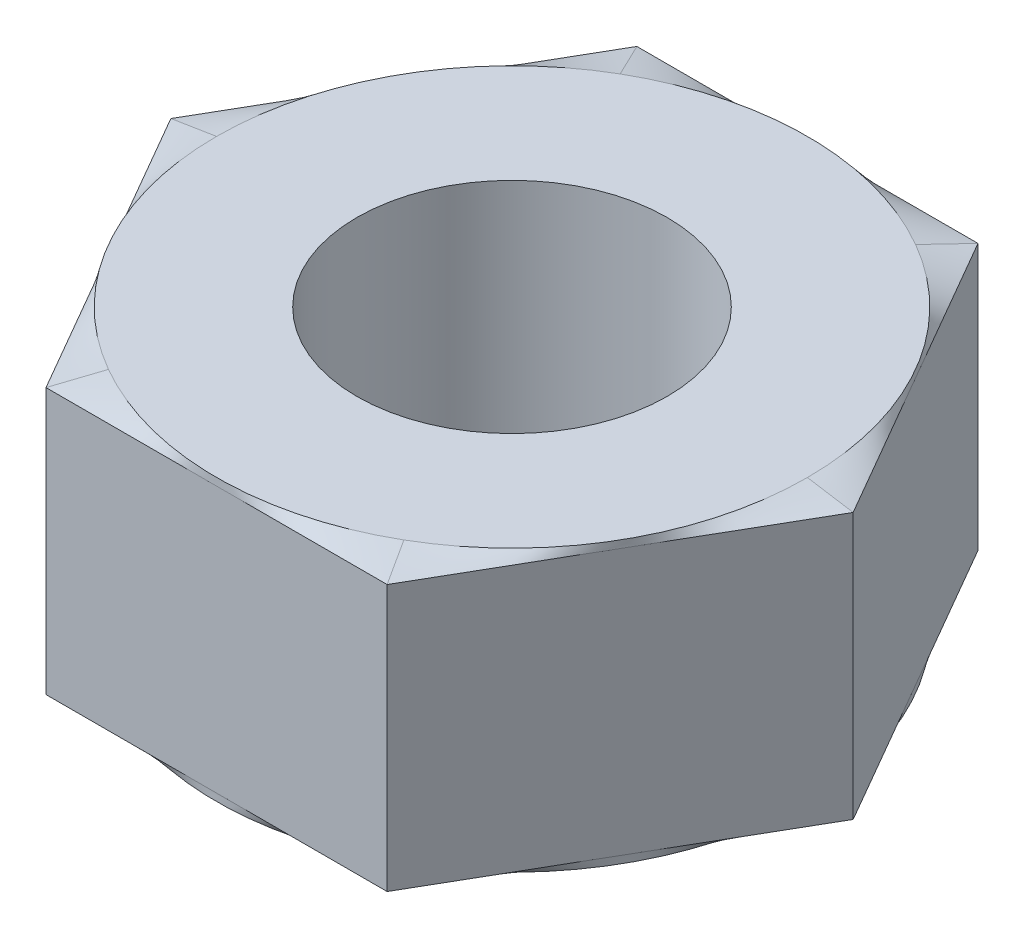
ISO-10303-21;
HEADER;
FILE_DESCRIPTION(('STEP AP214'),'2;1');
FILE_NAME('part.step','',(''),(''),'','','');
FILE_SCHEMA(('AUTOMOTIVE_DESIGN { 1 0 10303 214 1 1 1 1 }'));
ENDSEC;
DATA;
#1=APPLICATION_CONTEXT('core data for automotive mechanical design processes');
#2=APPLICATION_PROTOCOL_DEFINITION('international standard','automotive_design',2000,#1);
#3=PRODUCT_CONTEXT('',#1,'mechanical');
#4=PRODUCT('Part','Part','',(#3));
#5=PRODUCT_RELATED_PRODUCT_CATEGORY('part','',(#4));
#6=PRODUCT_DEFINITION_FORMATION('','',#4);
#7=PRODUCT_DEFINITION_CONTEXT('part definition',#1,'design');
#8=PRODUCT_DEFINITION('design','',#6,#7);
#9=PRODUCT_DEFINITION_SHAPE('','',#8);
#10=(LENGTH_UNIT() NAMED_UNIT(*) SI_UNIT(.MILLI.,.METRE.));
#11=(NAMED_UNIT(*) PLANE_ANGLE_UNIT() SI_UNIT($,.RADIAN.));
#12=(NAMED_UNIT(*) SI_UNIT($,.STERADIAN.) SOLID_ANGLE_UNIT());
#13=UNCERTAINTY_MEASURE_WITH_UNIT(LENGTH_MEASURE(1.E-05),#10,'distance_accuracy_value','');
#14=(GEOMETRIC_REPRESENTATION_CONTEXT(3) GLOBAL_UNCERTAINTY_ASSIGNED_CONTEXT((#13)) GLOBAL_UNIT_ASSIGNED_CONTEXT((#10,
#11,#12)) REPRESENTATION_CONTEXT('',''));
#15=CARTESIAN_POINT('',(0.,0.,0.));
#16=DIRECTION('',(0.,0.,1.));
#17=DIRECTION('',(1.,0.,0.));
#18=AXIS2_PLACEMENT_3D('',#15,#16,#17);
#19=CARTESIAN_POINT('',(2.3094010767585,1.8,-4.));
#20=DIRECTION('',(-0.866025403784439,0.,0.5));
#21=DIRECTION('',(-0.5,0.,-0.866025403784439));
#22=AXIS2_PLACEMENT_3D('',#19,#20,#21);
#23=PLANE('',#22);
#24=DIRECTION('',(-0.5,0.,-0.866025403784439));
#25=VECTOR('',#24,1.);
#26=CARTESIAN_POINT('',(2.3094010767585,0.,-4.));
#27=LINE('',#26,#25);
#28=CARTESIAN_POINT('',(2.3094010767585,0.,-4.));
#29=VERTEX_POINT('',#28);
#30=CARTESIAN_POINT('',(4.618802153517,0.,0.));
#31=VERTEX_POINT('',#30);
#32=EDGE_CURVE('E830',#29,#31,#27,.F.);
#33=ORIENTED_EDGE('',*,*,#32,.F.);
#34=DIRECTION('',(0.,-1.,0.));
#35=VECTOR('',#34,1.);
#36=CARTESIAN_POINT('',(2.3094010767585,1.8,-4.));
#37=LINE('',#36,#35);
#38=CARTESIAN_POINT('',(2.3094010767585,3.6,-4.));
#39=VERTEX_POINT('',#38);
#40=EDGE_CURVE('E547',#39,#29,#37,.T.);
#41=ORIENTED_EDGE('',*,*,#40,.F.);
#42=CARTESIAN_POINT('',(4.618802153517,3.6,0.));
#43=CARTESIAN_POINT('',(4.42635206378713,3.6,-0.33333333333333));
#44=CARTESIAN_POINT('',(4.23390197405726,3.6,-0.666666666666661));
#45=CARTESIAN_POINT('',(3.84900179459751,3.6,-1.33333333333333));
#46=CARTESIAN_POINT('',(3.65655170486763,3.6,-1.66666666666666));
#47=CARTESIAN_POINT('',(3.27165152540788,3.6,-2.33333333333333));
#48=CARTESIAN_POINT('',(3.07920143567801,3.6,-2.66666666666666));
#49=CARTESIAN_POINT('',(2.69430125621826,3.6,-3.33333333333333));
#50=CARTESIAN_POINT('',(2.50185116648838,3.6,-3.66666666666666));
#51=CARTESIAN_POINT('',(2.3094010767585,3.6,-4.));
#52=B_SPLINE_CURVE_WITH_KNOTS('',3,(#42,#43,#44,#45,#46,#47,#48,#49,#50,#51),.UNSPECIFIED.,.F.,
.F.,(4,2,2,2,4),(0.,0.25,0.5,0.75,1.),.UNSPECIFIED.);
#53=CARTESIAN_POINT('',(4.618802153517,3.6,0.));
#54=VERTEX_POINT('',#53);
#55=EDGE_CURVE('E308',#39,#54,#52,.F.);
#56=ORIENTED_EDGE('',*,*,#55,.T.);
#57=DIRECTION('',(0.,-1.,0.));
#58=VECTOR('',#57,1.);
#59=CARTESIAN_POINT('',(4.618802153517,1.8,0.));
#60=LINE('',#59,#58);
#61=EDGE_CURVE('E12',#54,#31,#60,.T.);
#62=ORIENTED_EDGE('',*,*,#61,.T.);
#63=EDGE_LOOP('',(#33,#41,#56,#62));
#64=FACE_BOUND('',#63,.T.);
#65=ADVANCED_FACE('F121',(#64),#23,.F.);
#66=CARTESIAN_POINT('',(4.618802153517,1.8,0.));
#67=DIRECTION('',(-0.866025403784438,0.,-0.5));
#68=DIRECTION('',(0.5,0.,-0.866025403784439));
#69=AXIS2_PLACEMENT_3D('',#66,#67,#68);
#70=PLANE('',#69);
#71=DIRECTION('',(0.5,0.,-0.866025403784439));
#72=VECTOR('',#71,1.);
#73=CARTESIAN_POINT('',(4.618802153517,0.,0.));
#74=LINE('',#73,#72);
#75=CARTESIAN_POINT('',(2.3094010767585,0.,4.));
#76=VERTEX_POINT('',#75);
#77=EDGE_CURVE('E860',#31,#76,#74,.F.);
#78=ORIENTED_EDGE('',*,*,#77,.F.);
#79=ORIENTED_EDGE('',*,*,#61,.F.);
#80=CARTESIAN_POINT('',(2.3094010767585,3.6,4.));
#81=CARTESIAN_POINT('',(2.40562612162344,3.6,3.83333333333333));
#82=CARTESIAN_POINT('',(2.50185116648838,3.6,3.66666666666667));
#83=CARTESIAN_POINT('',(2.69430125621825,3.6,3.33333333333333));
#84=CARTESIAN_POINT('',(2.79052630108319,3.6,3.16666666666666));
#85=CARTESIAN_POINT('',(2.98297639081307,3.6,2.83333333333333));
#86=CARTESIAN_POINT('',(3.079201435678,3.6,2.66666666666666));
#87=CARTESIAN_POINT('',(3.27165152540788,3.6,2.33333333333333));
#88=CARTESIAN_POINT('',(3.36787657027282,3.6,2.16666666666666));
#89=CARTESIAN_POINT('',(3.56032666000269,3.6,1.83333333333333));
#90=CARTESIAN_POINT('',(3.65655170486763,3.6,1.66666666666666));
#91=CARTESIAN_POINT('',(3.84900179459751,3.6,1.33333333333333));
#92=CARTESIAN_POINT('',(3.94522683946244,3.6,1.16666666666666));
#93=CARTESIAN_POINT('',(4.13767692919232,3.6,0.833333333333331));
#94=CARTESIAN_POINT('',(4.23390197405726,3.6,0.666666666666665));
#95=CARTESIAN_POINT('',(4.42635206378713,3.6,0.333333333333333));
#96=CARTESIAN_POINT('',(4.52257710865207,3.6,0.166666666666667));
#97=CARTESIAN_POINT('',(4.61880215351701,3.6,0.));
#98=B_SPLINE_CURVE_WITH_KNOTS('',3,(#80,#81,#82,#83,#84,#85,#86,#87,#88,#89,#90,#91,#92,#93,#94,
#95,#96,#97),.UNSPECIFIED.,.F.,.F.,(4,2,2,2,2,2,2,2,4),(0.,0.577350269189629,1.15470053837926,
1.73205080756888,2.30940107675851,2.88675134594813,3.46410161513776,4.04145188432738,
4.61880215351701),.UNSPECIFIED.);
#99=CARTESIAN_POINT('',(2.3094010767585,3.6,4.));
#100=VERTEX_POINT('',#99);
#101=EDGE_CURVE('E233',#54,#100,#98,.F.);
#102=ORIENTED_EDGE('',*,*,#101,.T.);
#103=DIRECTION('',(0.,-1.,0.));
#104=VECTOR('',#103,1.);
#105=CARTESIAN_POINT('',(2.3094010767585,1.8,4.));
#106=LINE('',#105,#104);
#107=EDGE_CURVE('E131',#100,#76,#106,.T.);
#108=ORIENTED_EDGE('',*,*,#107,.T.);
#109=EDGE_LOOP('',(#78,#79,#102,#108));
#110=FACE_BOUND('',#109,.T.);
#111=ADVANCED_FACE('F519',(#110),#70,.F.);
#112=CARTESIAN_POINT('',(2.3094010767585,1.8,4.));
#113=DIRECTION('',(0.,0.,-1.));
#114=DIRECTION('',(1.,0.,0.));
#115=AXIS2_PLACEMENT_3D('',#112,#113,#114);
#116=PLANE('',#115);
#117=DIRECTION('',(1.,0.,0.));
#118=VECTOR('',#117,1.);
#119=CARTESIAN_POINT('',(2.3094010767585,0.,4.));
#120=LINE('',#119,#118);
#121=CARTESIAN_POINT('',(-2.3094010767585,0.,4.));
#122=VERTEX_POINT('',#121);
#123=EDGE_CURVE('E858',#76,#122,#120,.F.);
#124=ORIENTED_EDGE('',*,*,#123,.F.);
#125=ORIENTED_EDGE('',*,*,#107,.F.);
#126=CARTESIAN_POINT('',(-2.30940107675851,3.6,4.));
#127=CARTESIAN_POINT('',(-2.11695098702863,3.6,4.));
#128=CARTESIAN_POINT('',(-1.92450089729876,3.6,4.));
#129=CARTESIAN_POINT('',(-1.53960071783901,3.6,4.));
#130=CARTESIAN_POINT('',(-1.34715062810913,3.6,4.));
#131=CARTESIAN_POINT('',(-0.96225044864938,3.6,4.));
#132=CARTESIAN_POINT('',(-0.769800358919504,3.6,4.));
#133=CARTESIAN_POINT('',(-0.384900179459754,3.6,4.));
#134=CARTESIAN_POINT('',(-0.192450089729879,3.6,4.));
#135=CARTESIAN_POINT('',(0.192450089729872,3.6,4.));
#136=CARTESIAN_POINT('',(0.384900179459747,3.6,4.));
#137=CARTESIAN_POINT('',(0.769800358919498,3.6,4.));
#138=CARTESIAN_POINT('',(0.962250448649373,3.6,4.));
#139=CARTESIAN_POINT('',(1.34715062810912,3.6,4.));
#140=CARTESIAN_POINT('',(1.539600717839,3.6,4.));
#141=CARTESIAN_POINT('',(1.92450089729875,3.6,4.));
#142=CARTESIAN_POINT('',(2.11695098702863,3.6,4.));
#143=CARTESIAN_POINT('',(2.3094010767585,3.6,4.));
#144=B_SPLINE_CURVE_WITH_KNOTS('',3,(#126,#127,#128,#129,#130,#131,#132,#133,#134,#135,#136,
#137,#138,#139,#140,#141,#142,#143),.UNSPECIFIED.,.F.,.F.,(4,2,2,2,2,2,2,2,4),(0.,
0.577350269189625,1.15470053837925,1.73205080756888,2.3094010767585,2.88675134594813,
3.46410161513775,4.04145188432738,4.61880215351701),.UNSPECIFIED.);
#145=CARTESIAN_POINT('',(-2.3094010767585,3.6,4.));
#146=VERTEX_POINT('',#145);
#147=EDGE_CURVE('E468',#100,#146,#144,.F.);
#148=ORIENTED_EDGE('',*,*,#147,.T.);
#149=DIRECTION('',(0.,-1.,0.));
#150=VECTOR('',#149,1.);
#151=CARTESIAN_POINT('',(-2.3094010767585,1.8,4.));
#152=LINE('',#151,#150);
#153=EDGE_CURVE('E493',#146,#122,#152,.T.);
#154=ORIENTED_EDGE('',*,*,#153,.T.);
#155=EDGE_LOOP('',(#124,#125,#148,#154));
#156=FACE_BOUND('',#155,.T.);
#157=ADVANCED_FACE('F501',(#156),#116,.F.);
#158=CARTESIAN_POINT('',(-2.3094010767585,1.8,4.));
#159=DIRECTION('',(0.866025403784439,0.,-0.5));
#160=DIRECTION('',(0.5,0.,0.866025403784439));
#161=AXIS2_PLACEMENT_3D('',#158,#159,#160);
#162=PLANE('',#161);
#163=DIRECTION('',(0.5,0.,0.866025403784439));
#164=VECTOR('',#163,1.);
#165=CARTESIAN_POINT('',(-2.3094010767585,0.,4.));
#166=LINE('',#165,#164);
#167=CARTESIAN_POINT('',(-4.61880215351701,0.,0.));
#168=VERTEX_POINT('',#167);
#169=EDGE_CURVE('E496',#122,#168,#166,.F.);
#170=ORIENTED_EDGE('',*,*,#169,.F.);
#171=ORIENTED_EDGE('',*,*,#153,.F.);
#172=CARTESIAN_POINT('',(-4.61880215351701,3.6,0.));
#173=CARTESIAN_POINT('',(-4.52257710865207,3.6,0.166666666666666));
#174=CARTESIAN_POINT('',(-4.42635206378713,3.6,0.333333333333333));
#175=CARTESIAN_POINT('',(-4.23390197405726,3.6,0.666666666666667));
#176=CARTESIAN_POINT('',(-4.13767692919232,3.6,0.833333333333333));
#177=CARTESIAN_POINT('',(-3.94522683946244,3.6,1.16666666666667));
#178=CARTESIAN_POINT('',(-3.84900179459751,3.6,1.33333333333333));
#179=CARTESIAN_POINT('',(-3.65655170486763,3.6,1.66666666666667));
#180=CARTESIAN_POINT('',(-3.56032666000269,3.6,1.83333333333333));
#181=CARTESIAN_POINT('',(-3.36787657027282,3.6,2.16666666666667));
#182=CARTESIAN_POINT('',(-3.27165152540788,3.6,2.33333333333333));
#183=CARTESIAN_POINT('',(-3.07920143567801,3.6,2.66666666666667));
#184=CARTESIAN_POINT('',(-2.98297639081307,3.6,2.83333333333333));
#185=CARTESIAN_POINT('',(-2.79052630108319,3.6,3.16666666666667));
#186=CARTESIAN_POINT('',(-2.69430125621825,3.6,3.33333333333333));
#187=CARTESIAN_POINT('',(-2.50185116648838,3.6,3.66666666666667));
#188=CARTESIAN_POINT('',(-2.40562612162344,3.6,3.83333333333334));
#189=CARTESIAN_POINT('',(-2.3094010767585,3.6,4.));
#190=B_SPLINE_CURVE_WITH_KNOTS('',3,(#172,#173,#174,#175,#176,#177,#178,#179,#180,#181,#182,
#183,#184,#185,#186,#187,#188,#189),.UNSPECIFIED.,.F.,.F.,(4,2,2,2,2,2,2,2,4),(0.,
0.577350269189627,1.15470053837925,1.73205080756888,2.3094010767585,2.88675134594813,
3.46410161513776,4.04145188432738,4.61880215351701),.UNSPECIFIED.);
#191=CARTESIAN_POINT('',(-4.61880215351701,3.6,0.));
#192=VERTEX_POINT('',#191);
#193=EDGE_CURVE('E479',#146,#192,#190,.F.);
#194=ORIENTED_EDGE('',*,*,#193,.T.);
#195=DIRECTION('',(0.,-1.,0.));
#196=VECTOR('',#195,1.);
#197=CARTESIAN_POINT('',(-4.61880215351701,1.8,0.));
#198=LINE('',#197,#196);
#199=EDGE_CURVE('E498',#192,#168,#198,.T.);
#200=ORIENTED_EDGE('',*,*,#199,.T.);
#201=EDGE_LOOP('',(#170,#171,#194,#200));
#202=FACE_BOUND('',#201,.T.);
#203=ADVANCED_FACE('F494',(#202),#162,.F.);
#204=CARTESIAN_POINT('',(-4.61880215351701,1.8,0.));
#205=DIRECTION('',(0.866025403784439,0.,0.5));
#206=DIRECTION('',(-0.5,0.,0.866025403784439));
#207=AXIS2_PLACEMENT_3D('',#204,#205,#206);
#208=PLANE('',#207);
#209=DIRECTION('',(-0.5,0.,0.866025403784439));
#210=VECTOR('',#209,1.);
#211=CARTESIAN_POINT('',(-4.61880215351701,0.,0.));
#212=LINE('',#211,#210);
#213=CARTESIAN_POINT('',(-2.3094010767585,0.,-4.));
#214=VERTEX_POINT('',#213);
#215=EDGE_CURVE('E852',#168,#214,#212,.F.);
#216=ORIENTED_EDGE('',*,*,#215,.F.);
#217=ORIENTED_EDGE('',*,*,#199,.F.);
#218=CARTESIAN_POINT('',(-2.3094010767585,3.6,-4.));
#219=CARTESIAN_POINT('',(-2.40562612162344,3.6,-3.83333333333334));
#220=CARTESIAN_POINT('',(-2.50185116648838,3.6,-3.66666666666667));
#221=CARTESIAN_POINT('',(-2.69430125621825,3.6,-3.33333333333333));
#222=CARTESIAN_POINT('',(-2.79052630108319,3.6,-3.16666666666667));
#223=CARTESIAN_POINT('',(-2.98297639081307,3.6,-2.83333333333333));
#224=CARTESIAN_POINT('',(-3.07920143567801,3.6,-2.66666666666667));
#225=CARTESIAN_POINT('',(-3.27165152540788,3.6,-2.33333333333333));
#226=CARTESIAN_POINT('',(-3.36787657027282,3.6,-2.16666666666667));
#227=CARTESIAN_POINT('',(-3.56032666000269,3.6,-1.83333333333333));
#228=CARTESIAN_POINT('',(-3.65655170486763,3.6,-1.66666666666667));
#229=CARTESIAN_POINT('',(-3.84900179459751,3.6,-1.33333333333333));
#230=CARTESIAN_POINT('',(-3.94522683946245,3.6,-1.16666666666667));
#231=CARTESIAN_POINT('',(-4.13767692919232,3.6,-0.833333333333333));
#232=CARTESIAN_POINT('',(-4.23390197405726,3.6,-0.666666666666666));
#233=CARTESIAN_POINT('',(-4.42635206378713,3.6,-0.333333333333333));
#234=CARTESIAN_POINT('',(-4.52257710865207,3.6,-0.166666666666666));
#235=CARTESIAN_POINT('',(-4.61880215351701,3.6,0.));
#236=B_SPLINE_CURVE_WITH_KNOTS('',3,(#218,#219,#220,#221,#222,#223,#224,#225,#226,#227,#228,
#229,#230,#231,#232,#233,#234,#235),.UNSPECIFIED.,.F.,.F.,(4,2,2,2,2,2,2,2,4),(0.,
0.577350269189627,1.15470053837925,1.73205080756888,2.30940107675851,2.88675134594813,
3.46410161513776,4.04145188432738,4.61880215351701),.UNSPECIFIED.);
#237=CARTESIAN_POINT('',(-2.3094010767585,3.6,-4.));
#238=VERTEX_POINT('',#237);
#239=EDGE_CURVE('E426',#192,#238,#236,.F.);
#240=ORIENTED_EDGE('',*,*,#239,.T.);
#241=DIRECTION('',(0.,-1.,0.));
#242=VECTOR('',#241,1.);
#243=CARTESIAN_POINT('',(-2.3094010767585,1.8,-4.));
#244=LINE('',#243,#242);
#245=EDGE_CURVE('E854',#238,#214,#244,.T.);
#246=ORIENTED_EDGE('',*,*,#245,.T.);
#247=EDGE_LOOP('',(#216,#217,#240,#246));
#248=FACE_BOUND('',#247,.T.);
#249=ADVANCED_FACE('F578',(#248),#208,.F.);
#250=CARTESIAN_POINT('',(-2.3094010767585,1.8,-4.));
#251=DIRECTION('',(0.,0.,1.));
#252=DIRECTION('',(-1.,0.,0.));
#253=AXIS2_PLACEMENT_3D('',#250,#251,#252);
#254=PLANE('',#253);
#255=DIRECTION('',(-1.,0.,0.));
#256=VECTOR('',#255,1.);
#257=CARTESIAN_POINT('',(-2.3094010767585,0.,-4.));
#258=LINE('',#257,#256);
#259=EDGE_CURVE('E855',#214,#29,#258,.F.);
#260=ORIENTED_EDGE('',*,*,#259,.F.);
#261=ORIENTED_EDGE('',*,*,#245,.F.);
#262=CARTESIAN_POINT('',(2.3094010767585,3.6,-4.));
#263=CARTESIAN_POINT('',(2.11695098702863,3.6,-4.));
#264=CARTESIAN_POINT('',(1.92450089729875,3.6,-4.));
#265=CARTESIAN_POINT('',(1.539600717839,3.6,-4.));
#266=CARTESIAN_POINT('',(1.34715062810913,3.6,-4.));
#267=CARTESIAN_POINT('',(0.962250448649375,3.6,-4.));
#268=CARTESIAN_POINT('',(0.769800358919499,3.6,-4.));
#269=CARTESIAN_POINT('',(0.384900179459749,3.6,-4.));
#270=CARTESIAN_POINT('',(0.192450089729873,3.6,-4.));
#271=CARTESIAN_POINT('',(-0.192450089729877,3.6,-4.));
#272=CARTESIAN_POINT('',(-0.384900179459752,3.6,-4.));
#273=CARTESIAN_POINT('',(-0.769800358919503,3.6,-4.));
#274=CARTESIAN_POINT('',(-0.962250448649378,3.6,-4.));
#275=CARTESIAN_POINT('',(-1.34715062810913,3.6,-4.));
#276=CARTESIAN_POINT('',(-1.539600717839,3.6,-4.));
#277=CARTESIAN_POINT('',(-1.92450089729875,3.6,-4.));
#278=CARTESIAN_POINT('',(-2.11695098702863,3.6,-4.));
#279=CARTESIAN_POINT('',(-2.3094010767585,3.6,-4.));
#280=B_SPLINE_CURVE_WITH_KNOTS('',3,(#262,#263,#264,#265,#266,#267,#268,#269,#270,#271,#272,
#273,#274,#275,#276,#277,#278,#279),.UNSPECIFIED.,.F.,.F.,(4,2,2,2,2,2,2,2,4),(0.,
0.577350269189627,1.15470053837925,1.73205080756888,2.30940107675851,2.88675134594813,
3.46410161513776,4.04145188432738,4.61880215351701),.UNSPECIFIED.);
#281=EDGE_CURVE('E322',#238,#39,#280,.F.);
#282=ORIENTED_EDGE('',*,*,#281,.T.);
#283=ORIENTED_EDGE('',*,*,#40,.T.);
#284=EDGE_LOOP('',(#260,#261,#282,#283));
#285=FACE_BOUND('',#284,.T.);
#286=ADVANCED_FACE('F584',(#285),#254,.F.);
#287=CARTESIAN_POINT('',(0.,-0.1,0.));
#288=DIRECTION('',(0.,-1.,0.));
#289=DIRECTION('',(0.,0.,1.));
#290=AXIS2_PLACEMENT_3D('',#287,#288,#289);
#291=PLANE('',#290);
#292=CARTESIAN_POINT('',(0.,-0.1,0.));
#293=DIRECTION('',(0.,-1.,0.));
#294=DIRECTION('',(0.,0.,-1.));
#295=AXIS2_PLACEMENT_3D('',#292,#293,#294);
#296=CIRCLE('',#295,2.1);
#297=CARTESIAN_POINT('',(0.,-0.1,-2.1));
#298=VERTEX_POINT('',#297);
#299=EDGE_CURVE('E371',#298,#298,#296,.T.);
#300=ORIENTED_EDGE('',*,*,#299,.F.);
#301=EDGE_LOOP('',(#300));
#302=FACE_BOUND('',#301,.T.);
#303=CARTESIAN_POINT('',(0.,-0.1,0.));
#304=DIRECTION('',(0.,1.,0.));
#305=DIRECTION('',(0.,0.,1.));
#306=AXIS2_PLACEMENT_3D('',#303,#304,#305);
#307=CIRCLE('',#306,4.);
#308=CARTESIAN_POINT('',(4.,-0.1,0.));
#309=VERTEX_POINT('',#308);
#310=CARTESIAN_POINT('',(2.,-0.1,-3.46410161513776));
#311=VERTEX_POINT('',#310);
#312=EDGE_CURVE('E704',#309,#311,#307,.T.);
#313=ORIENTED_EDGE('',*,*,#312,.F.);
#314=CARTESIAN_POINT('',(2.,-0.1,3.46410161513776));
#315=VERTEX_POINT('',#314);
#316=EDGE_CURVE('E707',#315,#309,#307,.T.);
#317=ORIENTED_EDGE('',*,*,#316,.F.);
#318=CARTESIAN_POINT('',(-2.,-0.1,3.46410161513776));
#319=VERTEX_POINT('',#318);
#320=EDGE_CURVE('E755',#319,#315,#307,.T.);
#321=ORIENTED_EDGE('',*,*,#320,.F.);
#322=CARTESIAN_POINT('',(-4.,-0.1,0.));
#323=VERTEX_POINT('',#322);
#324=EDGE_CURVE('E761',#323,#319,#307,.T.);
#325=ORIENTED_EDGE('',*,*,#324,.F.);
#326=CARTESIAN_POINT('',(-2.,-0.1,-3.46410161513776));
#327=VERTEX_POINT('',#326);
#328=EDGE_CURVE('E772',#327,#323,#307,.T.);
#329=ORIENTED_EDGE('',*,*,#328,.F.);
#330=EDGE_CURVE('E710',#311,#327,#307,.T.);
#331=ORIENTED_EDGE('',*,*,#330,.F.);
#332=EDGE_LOOP('',(#313,#317,#321,#325,#329,#331));
#333=FACE_BOUND('',#332,.T.);
#334=ADVANCED_FACE('F591',(#302,#333),#291,.T.);
#335=CARTESIAN_POINT('',(-2.,-0.1,3.46410161513776));
#336=CARTESIAN_POINT('',(-2.3094010767585,0.,4.));
#337=CARTESIAN_POINT('',(-2.28867513459481,-0.1,3.29743494847109));
#338=CARTESIAN_POINT('',(-2.50185116648838,0.,3.66666666666667));
#339=CARTESIAN_POINT('',(-2.56618919069857,-0.1,3.08834100997488));
#340=CARTESIAN_POINT('',(-2.69430125621825,0.,3.33333333333333));
#341=CARTESIAN_POINT('',(-3.06479008625264,-0.1,2.59427039522837));
#342=CARTESIAN_POINT('',(-3.07920143567801,0.,2.66666666666667));
#343=CARTESIAN_POINT('',(-3.28546882018367,-0.1,2.3094010767585));
#344=CARTESIAN_POINT('',(-3.27165152540788,0.,2.33333333333333));
#345=CARTESIAN_POINT('',(-3.64273441009184,-0.1,1.6905989232415));
#346=CARTESIAN_POINT('',(-3.65655170486763,0.,1.66666666666667));
#347=CARTESIAN_POINT('',(-3.77909910967998,-0.1,1.35705087434731));
#348=CARTESIAN_POINT('',(-3.84900179459751,0.,1.33333333333333));
#349=CARTESIAN_POINT('',(-3.95767636553682,-0.1,0.678214525074557));
#350=CARTESIAN_POINT('',(-4.23390197405726,0.,0.666666666666666));
#351=CARTESIAN_POINT('',(-4.,-0.1,0.333333333333333));
#352=CARTESIAN_POINT('',(-4.42635206378713,0.,0.333333333333333));
#353=CARTESIAN_POINT('',(-4.,-0.1,0.));
#354=CARTESIAN_POINT('',(-4.61880215351701,0.,0.));
#355=B_SPLINE_SURFACE_WITH_KNOTS('',3,1,((#335,#336),(#337,#338),(#339,#340),(#341,#342),(#343,
#344),(#345,#346),(#347,#348),(#349,#350),(#351,#352),(#353,#354)),.UNSPECIFIED.,.F.,.F.,.F.,(4,
2,2,2,4),(2,2),(0.,0.25,0.5,0.75,1.),(0.,1.),.UNSPECIFIED.);
#356=DIRECTION('',(0.49359631135726,-0.159532835673524,-0.854933889699356));
#357=VECTOR('',#356,1.);
#358=CARTESIAN_POINT('',(-2.15470053837925,-0.05,3.73205080756888));
#359=LINE('',#358,#357);
#360=EDGE_CURVE('E713',#122,#319,#359,.T.);
#361=DIRECTION('',(-0.987192622714516,0.159532835673524,0.));
#362=VECTOR('',#361,1.);
#363=CARTESIAN_POINT('',(-4.3094010767585,-0.05,0.));
#364=LINE('',#363,#362);
#365=EDGE_CURVE('E824',#323,#168,#364,.T.);
#366=ORIENTED_EDGE('',*,*,#324,.T.);
#367=ORIENTED_EDGE('',*,*,#360,.F.);
#368=ORIENTED_EDGE('',*,*,#169,.T.);
#369=ORIENTED_EDGE('',*,*,#365,.F.);
#370=EDGE_LOOP('',(#366,#367,#368,#369));
#371=FACE_BOUND('',#370,.T.);
#372=ADVANCED_FACE('F599',(#371),#355,.F.);
#373=CARTESIAN_POINT('',(-4.,-0.1,0.));
#374=CARTESIAN_POINT('',(-4.61880215351701,0.,0.));
#375=CARTESIAN_POINT('',(-4.,-0.1,-0.333333333333334));
#376=CARTESIAN_POINT('',(-4.42635206378713,0.,-0.333333333333333));
#377=CARTESIAN_POINT('',(-3.95767636553682,-0.1,-0.678214525074558));
#378=CARTESIAN_POINT('',(-4.23390197405726,0.,-0.666666666666666));
#379=CARTESIAN_POINT('',(-3.77909910967998,-0.1,-1.35705087434731));
#380=CARTESIAN_POINT('',(-3.84900179459751,0.,-1.33333333333333));
#381=CARTESIAN_POINT('',(-3.64273441009184,-0.1,-1.6905989232415));
#382=CARTESIAN_POINT('',(-3.65655170486763,0.,-1.66666666666667));
#383=CARTESIAN_POINT('',(-3.28546882018367,-0.1,-2.30940107675851));
#384=CARTESIAN_POINT('',(-3.27165152540788,0.,-2.33333333333333));
#385=CARTESIAN_POINT('',(-3.06479008625264,-0.1,-2.59427039522837));
#386=CARTESIAN_POINT('',(-3.07920143567801,0.,-2.66666666666667));
#387=CARTESIAN_POINT('',(-2.56618919069857,-0.1,-3.08834100997488));
#388=CARTESIAN_POINT('',(-2.69430125621825,0.,-3.33333333333333));
#389=CARTESIAN_POINT('',(-2.28867513459481,-0.1,-3.29743494847109));
#390=CARTESIAN_POINT('',(-2.50185116648838,0.,-3.66666666666667));
#391=CARTESIAN_POINT('',(-2.,-0.1,-3.46410161513776));
#392=CARTESIAN_POINT('',(-2.3094010767585,0.,-4.));
#393=B_SPLINE_SURFACE_WITH_KNOTS('',3,1,((#373,#374),(#375,#376),(#377,#378),(#379,#380),(#381,
#382),(#383,#384),(#385,#386),(#387,#388),(#389,#390),(#391,#392)),.UNSPECIFIED.,.F.,.F.,.F.,(4,
2,2,2,4),(2,2),(0.,0.25,0.5,0.75,1.),(0.,1.),.UNSPECIFIED.);
#394=DIRECTION('',(-0.49359631135726,0.159532835673524,-0.854933889699356));
#395=VECTOR('',#394,1.);
#396=CARTESIAN_POINT('',(-2.15470053837925,-0.05,-3.73205080756888));
#397=LINE('',#396,#395);
#398=EDGE_CURVE('E177',#327,#214,#397,.T.);
#399=ORIENTED_EDGE('',*,*,#328,.T.);
#400=ORIENTED_EDGE('',*,*,#365,.T.);
#401=ORIENTED_EDGE('',*,*,#215,.T.);
#402=ORIENTED_EDGE('',*,*,#398,.F.);
#403=EDGE_LOOP('',(#399,#400,#401,#402));
#404=FACE_BOUND('',#403,.T.);
#405=ADVANCED_FACE('F606',(#404),#393,.F.);
#406=CARTESIAN_POINT('',(2.,-0.1,3.46410161513776));
#407=CARTESIAN_POINT('',(2.3094010767585,0.,4.));
#408=CARTESIAN_POINT('',(1.71132486540519,-0.1,3.63076828180442));
#409=CARTESIAN_POINT('',(1.92450089729875,0.,4.));
#410=CARTESIAN_POINT('',(1.39148717483824,-0.1,3.76655553504943));
#411=CARTESIAN_POINT('',(1.539600717839,0.,4.));
#412=CARTESIAN_POINT('',(0.714309023427341,-0.1,3.95132126957567));
#413=CARTESIAN_POINT('',(0.769800358919496,0.,4.));
#414=CARTESIAN_POINT('',(0.357265589908163,-0.1,4.));
#415=CARTESIAN_POINT('',(0.384900179459746,0.,4.));
#416=CARTESIAN_POINT('',(-0.357265589908164,-0.1,4.));
#417=CARTESIAN_POINT('',(-0.384900179459754,0.,4.));
#418=CARTESIAN_POINT('',(-0.714309023427341,-0.1,3.95132126957567));
#419=CARTESIAN_POINT('',(-0.769800358919504,0.,4.));
#420=CARTESIAN_POINT('',(-1.39148717483824,-0.1,3.76655553504943));
#421=CARTESIAN_POINT('',(-1.539600717839,0.,4.));
#422=CARTESIAN_POINT('',(-1.71132486540519,-0.1,3.63076828180442));
#423=CARTESIAN_POINT('',(-1.92450089729875,0.,4.));
#424=CARTESIAN_POINT('',(-2.,-0.1,3.46410161513776));
#425=CARTESIAN_POINT('',(-2.3094010767585,0.,4.));
#426=B_SPLINE_SURFACE_WITH_KNOTS('',3,1,((#406,#407),(#408,#409),(#410,#411),(#412,#413),(#414,
#415),(#416,#417),(#418,#419),(#420,#421),(#422,#423),(#424,#425)),.UNSPECIFIED.,.F.,.F.,.F.,(4,
2,2,2,4),(2,2),(0.,0.25,0.5,0.75,1.),(0.,1.),.UNSPECIFIED.);
#427=DIRECTION('',(0.493596311357257,0.159532835673525,0.854933889699358));
#428=VECTOR('',#427,1.);
#429=CARTESIAN_POINT('',(2.15470053837925,-0.05,3.73205080756888));
#430=LINE('',#429,#428);
#431=EDGE_CURVE('E140',#315,#76,#430,.T.);
#432=ORIENTED_EDGE('',*,*,#320,.T.);
#433=ORIENTED_EDGE('',*,*,#431,.T.);
#434=ORIENTED_EDGE('',*,*,#123,.T.);
#435=ORIENTED_EDGE('',*,*,#360,.T.);
#436=EDGE_LOOP('',(#432,#433,#434,#435));
#437=FACE_BOUND('',#436,.T.);
#438=ADVANCED_FACE('F614',(#437),#426,.F.);
#439=CARTESIAN_POINT('',(-2.,-0.1,-3.46410161513776));
#440=CARTESIAN_POINT('',(-2.3094010767585,0.,-4.));
#441=CARTESIAN_POINT('',(-1.71132486540519,-0.1,-3.63076828180442));
#442=CARTESIAN_POINT('',(-1.92450089729875,0.,-4.));
#443=CARTESIAN_POINT('',(-1.39148717483824,-0.1,-3.76655553504943));
#444=CARTESIAN_POINT('',(-1.539600717839,0.,-4.));
#445=CARTESIAN_POINT('',(-0.714309023427341,-0.1,-3.95132126957567));
#446=CARTESIAN_POINT('',(-0.769800358919503,0.,-4.));
#447=CARTESIAN_POINT('',(-0.357265589908163,-0.1,-4.));
#448=CARTESIAN_POINT('',(-0.384900179459752,0.,-4.));
#449=CARTESIAN_POINT('',(0.357265589908164,-0.1,-4.));
#450=CARTESIAN_POINT('',(0.384900179459749,0.,-4.));
#451=CARTESIAN_POINT('',(0.714309023427341,-0.1,-3.95132126957567));
#452=CARTESIAN_POINT('',(0.7698003589195,0.,-4.));
#453=CARTESIAN_POINT('',(1.39148717483825,-0.1,-3.76655553504943));
#454=CARTESIAN_POINT('',(1.539600717839,0.,-4.));
#455=CARTESIAN_POINT('',(1.71132486540519,-0.1,-3.63076828180442));
#456=CARTESIAN_POINT('',(1.92450089729875,0.,-4.));
#457=CARTESIAN_POINT('',(2.,-0.1,-3.46410161513776));
#458=CARTESIAN_POINT('',(2.3094010767585,0.,-4.));
#459=B_SPLINE_SURFACE_WITH_KNOTS('',3,1,((#439,#440),(#441,#442),(#443,#444),(#445,#446),(#447,
#448),(#449,#450),(#451,#452),(#453,#454),(#455,#456),(#457,#458)),.UNSPECIFIED.,.F.,.F.,.F.,(4,
2,2,2,4),(2,2),(0.,0.25,0.5,0.75,1.),(0.,1.),.UNSPECIFIED.);
#460=DIRECTION('',(0.493596311357257,0.159532835673524,-0.854933889699358));
#461=VECTOR('',#460,1.);
#462=CARTESIAN_POINT('',(2.15470053837925,-0.05,-3.73205080756888));
#463=LINE('',#462,#461);
#464=EDGE_CURVE('E159',#311,#29,#463,.T.);
#465=ORIENTED_EDGE('',*,*,#330,.T.);
#466=ORIENTED_EDGE('',*,*,#398,.T.);
#467=ORIENTED_EDGE('',*,*,#259,.T.);
#468=ORIENTED_EDGE('',*,*,#464,.F.);
#469=EDGE_LOOP('',(#465,#466,#467,#468));
#470=FACE_BOUND('',#469,.T.);
#471=ADVANCED_FACE('F621',(#470),#459,.F.);
#472=CARTESIAN_POINT('',(2.,-0.1,-3.46410161513776));
#473=CARTESIAN_POINT('',(2.3094010767585,0.,-4.));
#474=CARTESIAN_POINT('',(2.28867513459481,-0.1,-3.29743494847109));
#475=CARTESIAN_POINT('',(2.50185116648838,0.,-3.66666666666666));
#476=CARTESIAN_POINT('',(2.56618919069857,-0.1,-3.08834100997488));
#477=CARTESIAN_POINT('',(2.69430125621826,0.,-3.33333333333333));
#478=CARTESIAN_POINT('',(3.06479008625264,-0.1,-2.59427039522837));
#479=CARTESIAN_POINT('',(3.07920143567801,0.,-2.66666666666666));
#480=CARTESIAN_POINT('',(3.28546882018367,-0.1,-2.3094010767585));
#481=CARTESIAN_POINT('',(3.27165152540788,0.,-2.33333333333333));
#482=CARTESIAN_POINT('',(3.64273441009184,-0.1,-1.6905989232415));
#483=CARTESIAN_POINT('',(3.65655170486763,0.,-1.66666666666666));
#484=CARTESIAN_POINT('',(3.77909910967998,-0.1,-1.35705087434731));
#485=CARTESIAN_POINT('',(3.84900179459751,0.,-1.33333333333333));
#486=CARTESIAN_POINT('',(3.95767636553682,-0.1,-0.678214525074556));
#487=CARTESIAN_POINT('',(4.23390197405726,0.,-0.666666666666661));
#488=CARTESIAN_POINT('',(4.,-0.1,-0.333333333333332));
#489=CARTESIAN_POINT('',(4.42635206378713,0.,-0.33333333333333));
#490=CARTESIAN_POINT('',(4.,-0.1,0.));
#491=CARTESIAN_POINT('',(4.618802153517,0.,0.));
#492=B_SPLINE_SURFACE_WITH_KNOTS('',3,1,((#472,#473),(#474,#475),(#476,#477),(#478,#479),(#480,
#481),(#482,#483),(#484,#485),(#486,#487),(#488,#489),(#490,#491)),.UNSPECIFIED.,.F.,.F.,.F.,(4,
2,2,2,4),(2,2),(0.,0.25,0.5,0.75,1.),(0.,1.),.UNSPECIFIED.);
#493=DIRECTION('',(0.987192622714516,0.159532835673525,0.));
#494=VECTOR('',#493,1.);
#495=CARTESIAN_POINT('',(4.3094010767585,-0.05,0.));
#496=LINE('',#495,#494);
#497=EDGE_CURVE('E166',#309,#31,#496,.T.);
#498=ORIENTED_EDGE('',*,*,#312,.T.);
#499=ORIENTED_EDGE('',*,*,#464,.T.);
#500=ORIENTED_EDGE('',*,*,#32,.T.);
#501=ORIENTED_EDGE('',*,*,#497,.F.);
#502=EDGE_LOOP('',(#498,#499,#500,#501));
#503=FACE_BOUND('',#502,.T.);
#504=ADVANCED_FACE('F628',(#503),#492,.F.);
#505=CARTESIAN_POINT('',(4.,-0.1,0.));
#506=CARTESIAN_POINT('',(4.618802153517,0.,0.));
#507=CARTESIAN_POINT('',(4.,-0.1,0.333333333333335));
#508=CARTESIAN_POINT('',(4.42635206378713,0.,0.333333333333333));
#509=CARTESIAN_POINT('',(3.95767636553682,-0.1,0.678214525074558));
#510=CARTESIAN_POINT('',(4.23390197405725,0.,0.666666666666665));
#511=CARTESIAN_POINT('',(3.77909910967998,-0.1,1.35705087434731));
#512=CARTESIAN_POINT('',(3.84900179459751,0.,1.33333333333333));
#513=CARTESIAN_POINT('',(3.64273441009184,-0.1,1.6905989232415));
#514=CARTESIAN_POINT('',(3.65655170486763,0.,1.66666666666666));
#515=CARTESIAN_POINT('',(3.28546882018367,-0.1,2.3094010767585));
#516=CARTESIAN_POINT('',(3.27165152540788,0.,2.33333333333333));
#517=CARTESIAN_POINT('',(3.06479008625264,-0.1,2.59427039522837));
#518=CARTESIAN_POINT('',(3.079201435678,0.,2.66666666666666));
#519=CARTESIAN_POINT('',(2.56618919069857,-0.1,3.08834100997488));
#520=CARTESIAN_POINT('',(2.69430125621825,0.,3.33333333333333));
#521=CARTESIAN_POINT('',(2.28867513459481,-0.1,3.29743494847109));
#522=CARTESIAN_POINT('',(2.50185116648838,0.,3.66666666666667));
#523=CARTESIAN_POINT('',(2.,-0.1,3.46410161513776));
#524=CARTESIAN_POINT('',(2.3094010767585,0.,4.));
#525=B_SPLINE_SURFACE_WITH_KNOTS('',3,1,((#505,#506),(#507,#508),(#509,#510),(#511,#512),(#513,
#514),(#515,#516),(#517,#518),(#519,#520),(#521,#522),(#523,#524)),.UNSPECIFIED.,.F.,.F.,.F.,(4,
2,2,2,4),(2,2),(0.,0.25,0.5,0.75,1.),(0.,1.),.UNSPECIFIED.);
#526=ORIENTED_EDGE('',*,*,#316,.T.);
#527=ORIENTED_EDGE('',*,*,#497,.T.);
#528=ORIENTED_EDGE('',*,*,#77,.T.);
#529=ORIENTED_EDGE('',*,*,#431,.F.);
#530=EDGE_LOOP('',(#526,#527,#528,#529));
#531=FACE_BOUND('',#530,.T.);
#532=ADVANCED_FACE('F402',(#531),#525,.F.);
#533=CARTESIAN_POINT('',(0.,3.7,0.));
#534=DIRECTION('',(0.,1.,0.));
#535=DIRECTION('',(0.,0.,1.));
#536=AXIS2_PLACEMENT_3D('',#533,#534,#535);
#537=PLANE('',#536);
#538=CARTESIAN_POINT('',(0.,3.7,0.));
#539=DIRECTION('',(0.,-1.,0.));
#540=DIRECTION('',(0.,0.,-1.));
#541=AXIS2_PLACEMENT_3D('',#538,#539,#540);
#542=CIRCLE('',#541,2.1);
#543=CARTESIAN_POINT('',(0.,3.7,-2.1));
#544=VERTEX_POINT('',#543);
#545=EDGE_CURVE('E125',#544,#544,#542,.F.);
#546=ORIENTED_EDGE('',*,*,#545,.F.);
#547=EDGE_LOOP('',(#546));
#548=FACE_BOUND('',#547,.T.);
#549=CARTESIAN_POINT('',(0.,3.7,0.));
#550=DIRECTION('',(0.,1.,0.));
#551=DIRECTION('',(0.,0.,1.));
#552=AXIS2_PLACEMENT_3D('',#549,#550,#551);
#553=CIRCLE('',#552,4.);
#554=CARTESIAN_POINT('',(4.,3.7,0.));
#555=VERTEX_POINT('',#554);
#556=CARTESIAN_POINT('',(2.,3.7,-3.46410161513776));
#557=VERTEX_POINT('',#556);
#558=EDGE_CURVE('E247',#555,#557,#553,.T.);
#559=ORIENTED_EDGE('',*,*,#558,.T.);
#560=CARTESIAN_POINT('',(-2.,3.7,-3.46410161513776));
#561=VERTEX_POINT('',#560);
#562=EDGE_CURVE('E260',#557,#561,#553,.T.);
#563=ORIENTED_EDGE('',*,*,#562,.T.);
#564=CARTESIAN_POINT('',(-4.,3.7,0.));
#565=VERTEX_POINT('',#564);
#566=EDGE_CURVE('E383',#561,#565,#553,.T.);
#567=ORIENTED_EDGE('',*,*,#566,.T.);
#568=CARTESIAN_POINT('',(-2.,3.7,3.46410161513776));
#569=VERTEX_POINT('',#568);
#570=EDGE_CURVE('E387',#565,#569,#553,.T.);
#571=ORIENTED_EDGE('',*,*,#570,.T.);
#572=CARTESIAN_POINT('',(2.,3.7,3.46410161513776));
#573=VERTEX_POINT('',#572);
#574=EDGE_CURVE('E251',#569,#573,#553,.T.);
#575=ORIENTED_EDGE('',*,*,#574,.T.);
#576=EDGE_CURVE('E229',#573,#555,#553,.T.);
#577=ORIENTED_EDGE('',*,*,#576,.T.);
#578=EDGE_LOOP('',(#559,#563,#567,#571,#575,#577));
#579=FACE_BOUND('',#578,.T.);
#580=ADVANCED_FACE('F245',(#548,#579),#537,.T.);
#581=CARTESIAN_POINT('',(-2.,3.7,3.46410161513776));
#582=CARTESIAN_POINT('',(-2.3094010767585,3.6,4.));
#583=CARTESIAN_POINT('',(-2.28867513459481,3.7,3.29743494847109));
#584=CARTESIAN_POINT('',(-2.50185116648838,3.6,3.66666666666667));
#585=CARTESIAN_POINT('',(-2.56618919069857,3.7,3.08834100997488));
#586=CARTESIAN_POINT('',(-2.69430125621825,3.6,3.33333333333333));
#587=CARTESIAN_POINT('',(-3.06479008625264,3.7,2.59427039522837));
#588=CARTESIAN_POINT('',(-3.07920143567801,3.6,2.66666666666667));
#589=CARTESIAN_POINT('',(-3.28546882018367,3.7,2.3094010767585));
#590=CARTESIAN_POINT('',(-3.27165152540788,3.6,2.33333333333333));
#591=CARTESIAN_POINT('',(-3.64273441009184,3.7,1.6905989232415));
#592=CARTESIAN_POINT('',(-3.65655170486763,3.6,1.66666666666667));
#593=CARTESIAN_POINT('',(-3.77909910967998,3.7,1.35705087434731));
#594=CARTESIAN_POINT('',(-3.84900179459751,3.6,1.33333333333333));
#595=CARTESIAN_POINT('',(-3.95767636553682,3.7,0.678214525074557));
#596=CARTESIAN_POINT('',(-4.23390197405726,3.6,0.666666666666666));
#597=CARTESIAN_POINT('',(-4.,3.7,0.333333333333333));
#598=CARTESIAN_POINT('',(-4.42635206378713,3.6,0.333333333333333));
#599=CARTESIAN_POINT('',(-4.,3.7,0.));
#600=CARTESIAN_POINT('',(-4.61880215351701,3.6,0.));
#601=B_SPLINE_SURFACE_WITH_KNOTS('',3,1,((#581,#582),(#583,#584),(#585,#586),(#587,#588),(#589,
#590),(#591,#592),(#593,#594),(#595,#596),(#597,#598),(#599,#600)),.UNSPECIFIED.,.F.,.F.,.F.,(4,
2,2,2,4),(2,2),(0.,0.25,0.5,0.75,1.),(0.,1.),.UNSPECIFIED.);
#602=DIRECTION('',(-0.987192622714516,-0.159532835673524,0.));
#603=VECTOR('',#602,1.);
#604=CARTESIAN_POINT('',(-4.3094010767585,3.65,0.));
#605=LINE('',#604,#603);
#606=EDGE_CURVE('E424',#565,#192,#605,.T.);
#607=DIRECTION('',(0.49359631135726,0.159532835673524,-0.854933889699356));
#608=VECTOR('',#607,1.);
#609=CARTESIAN_POINT('',(-2.15470053837925,3.65,3.73205080756888));
#610=LINE('',#609,#608);
#611=EDGE_CURVE('E259',#146,#569,#610,.T.);
#612=ORIENTED_EDGE('',*,*,#570,.F.);
#613=ORIENTED_EDGE('',*,*,#606,.T.);
#614=ORIENTED_EDGE('',*,*,#193,.F.);
#615=ORIENTED_EDGE('',*,*,#611,.T.);
#616=EDGE_LOOP('',(#612,#613,#614,#615));
#617=FACE_BOUND('',#616,.T.);
#618=ADVANCED_FACE('F342',(#617),#601,.T.);
#619=CARTESIAN_POINT('',(-4.,3.7,0.));
#620=CARTESIAN_POINT('',(-4.61880215351701,3.6,0.));
#621=CARTESIAN_POINT('',(-4.,3.7,-0.333333333333334));
#622=CARTESIAN_POINT('',(-4.42635206378713,3.6,-0.333333333333333));
#623=CARTESIAN_POINT('',(-3.95767636553682,3.7,-0.678214525074558));
#624=CARTESIAN_POINT('',(-4.23390197405726,3.6,-0.666666666666666));
#625=CARTESIAN_POINT('',(-3.77909910967998,3.7,-1.35705087434731));
#626=CARTESIAN_POINT('',(-3.84900179459751,3.6,-1.33333333333333));
#627=CARTESIAN_POINT('',(-3.64273441009184,3.7,-1.6905989232415));
#628=CARTESIAN_POINT('',(-3.65655170486763,3.6,-1.66666666666667));
#629=CARTESIAN_POINT('',(-3.28546882018367,3.7,-2.30940107675851));
#630=CARTESIAN_POINT('',(-3.27165152540788,3.6,-2.33333333333333));
#631=CARTESIAN_POINT('',(-3.06479008625264,3.7,-2.59427039522837));
#632=CARTESIAN_POINT('',(-3.07920143567801,3.6,-2.66666666666667));
#633=CARTESIAN_POINT('',(-2.56618919069857,3.7,-3.08834100997488));
#634=CARTESIAN_POINT('',(-2.69430125621825,3.6,-3.33333333333333));
#635=CARTESIAN_POINT('',(-2.28867513459481,3.7,-3.29743494847109));
#636=CARTESIAN_POINT('',(-2.50185116648838,3.6,-3.66666666666667));
#637=CARTESIAN_POINT('',(-2.,3.7,-3.46410161513776));
#638=CARTESIAN_POINT('',(-2.3094010767585,3.6,-4.));
#639=B_SPLINE_SURFACE_WITH_KNOTS('',3,1,((#619,#620),(#621,#622),(#623,#624),(#625,#626),(#627,
#628),(#629,#630),(#631,#632),(#633,#634),(#635,#636),(#637,#638)),.UNSPECIFIED.,.F.,.F.,.F.,(4,
2,2,2,4),(2,2),(0.,0.25,0.5,0.75,1.),(0.,1.),.UNSPECIFIED.);
#640=DIRECTION('',(-0.49359631135726,-0.159532835673524,-0.854933889699356));
#641=VECTOR('',#640,1.);
#642=CARTESIAN_POINT('',(-2.15470053837925,3.65,-3.73205080756888));
#643=LINE('',#642,#641);
#644=EDGE_CURVE('E423',#561,#238,#643,.T.);
#645=ORIENTED_EDGE('',*,*,#566,.F.);
#646=ORIENTED_EDGE('',*,*,#644,.T.);
#647=ORIENTED_EDGE('',*,*,#239,.F.);
#648=ORIENTED_EDGE('',*,*,#606,.F.);
#649=EDGE_LOOP('',(#645,#646,#647,#648));
#650=FACE_BOUND('',#649,.T.);
#651=ADVANCED_FACE('F330',(#650),#639,.T.);
#652=CARTESIAN_POINT('',(2.,3.7,3.46410161513776));
#653=CARTESIAN_POINT('',(2.3094010767585,3.6,4.));
#654=CARTESIAN_POINT('',(1.71132486540519,3.7,3.63076828180442));
#655=CARTESIAN_POINT('',(1.92450089729875,3.6,4.));
#656=CARTESIAN_POINT('',(1.39148717483824,3.7,3.76655553504943));
#657=CARTESIAN_POINT('',(1.539600717839,3.6,4.));
#658=CARTESIAN_POINT('',(0.714309023427341,3.7,3.95132126957567));
#659=CARTESIAN_POINT('',(0.769800358919496,3.6,4.));
#660=CARTESIAN_POINT('',(0.357265589908163,3.7,4.));
#661=CARTESIAN_POINT('',(0.384900179459746,3.6,4.));
#662=CARTESIAN_POINT('',(-0.357265589908164,3.7,4.));
#663=CARTESIAN_POINT('',(-0.384900179459754,3.6,4.));
#664=CARTESIAN_POINT('',(-0.714309023427341,3.7,3.95132126957567));
#665=CARTESIAN_POINT('',(-0.769800358919504,3.6,4.));
#666=CARTESIAN_POINT('',(-1.39148717483824,3.7,3.76655553504943));
#667=CARTESIAN_POINT('',(-1.539600717839,3.6,4.));
#668=CARTESIAN_POINT('',(-1.71132486540519,3.7,3.63076828180442));
#669=CARTESIAN_POINT('',(-1.92450089729875,3.6,4.));
#670=CARTESIAN_POINT('',(-2.,3.7,3.46410161513776));
#671=CARTESIAN_POINT('',(-2.3094010767585,3.6,4.));
#672=B_SPLINE_SURFACE_WITH_KNOTS('',3,1,((#652,#653),(#654,#655),(#656,#657),(#658,#659),(#660,
#661),(#662,#663),(#664,#665),(#666,#667),(#668,#669),(#670,#671)),.UNSPECIFIED.,.F.,.F.,.F.,(4,
2,2,2,4),(2,2),(0.,0.25,0.5,0.75,1.),(0.,1.),.UNSPECIFIED.);
#673=DIRECTION('',(0.493596311357257,-0.159532835673525,0.854933889699358));
#674=VECTOR('',#673,1.);
#675=CARTESIAN_POINT('',(2.15470053837925,3.65,3.73205080756888));
#676=LINE('',#675,#674);
#677=EDGE_CURVE('E239',#573,#100,#676,.T.);
#678=ORIENTED_EDGE('',*,*,#574,.F.);
#679=ORIENTED_EDGE('',*,*,#611,.F.);
#680=ORIENTED_EDGE('',*,*,#147,.F.);
#681=ORIENTED_EDGE('',*,*,#677,.F.);
#682=EDGE_LOOP('',(#678,#679,#680,#681));
#683=FACE_BOUND('',#682,.T.);
#684=ADVANCED_FACE('F341',(#683),#672,.T.);
#685=CARTESIAN_POINT('',(-2.,3.7,-3.46410161513776));
#686=CARTESIAN_POINT('',(-2.3094010767585,3.6,-4.));
#687=CARTESIAN_POINT('',(-1.71132486540519,3.7,-3.63076828180442));
#688=CARTESIAN_POINT('',(-1.92450089729875,3.6,-4.));
#689=CARTESIAN_POINT('',(-1.39148717483824,3.7,-3.76655553504943));
#690=CARTESIAN_POINT('',(-1.539600717839,3.6,-4.));
#691=CARTESIAN_POINT('',(-0.714309023427341,3.7,-3.95132126957567));
#692=CARTESIAN_POINT('',(-0.769800358919503,3.6,-4.));
#693=CARTESIAN_POINT('',(-0.357265589908163,3.7,-4.));
#694=CARTESIAN_POINT('',(-0.384900179459752,3.6,-4.));
#695=CARTESIAN_POINT('',(0.357265589908164,3.7,-4.));
#696=CARTESIAN_POINT('',(0.384900179459749,3.6,-4.));
#697=CARTESIAN_POINT('',(0.714309023427341,3.7,-3.95132126957567));
#698=CARTESIAN_POINT('',(0.7698003589195,3.6,-4.));
#699=CARTESIAN_POINT('',(1.39148717483825,3.7,-3.76655553504943));
#700=CARTESIAN_POINT('',(1.539600717839,3.6,-4.));
#701=CARTESIAN_POINT('',(1.71132486540519,3.7,-3.63076828180442));
#702=CARTESIAN_POINT('',(1.92450089729875,3.6,-4.));
#703=CARTESIAN_POINT('',(2.,3.7,-3.46410161513776));
#704=CARTESIAN_POINT('',(2.3094010767585,3.6,-4.));
#705=B_SPLINE_SURFACE_WITH_KNOTS('',3,1,((#685,#686),(#687,#688),(#689,#690),(#691,#692),(#693,
#694),(#695,#696),(#697,#698),(#699,#700),(#701,#702),(#703,#704)),.UNSPECIFIED.,.F.,.F.,.F.,(4,
2,2,2,4),(2,2),(0.,0.25,0.5,0.75,1.),(0.,1.),.UNSPECIFIED.);
#706=DIRECTION('',(0.493596311357257,-0.159532835673524,-0.854933889699358));
#707=VECTOR('',#706,1.);
#708=CARTESIAN_POINT('',(2.15470053837925,3.65,-3.73205080756888));
#709=LINE('',#708,#707);
#710=EDGE_CURVE('E240',#557,#39,#709,.T.);
#711=ORIENTED_EDGE('',*,*,#562,.F.);
#712=ORIENTED_EDGE('',*,*,#710,.T.);
#713=ORIENTED_EDGE('',*,*,#281,.F.);
#714=ORIENTED_EDGE('',*,*,#644,.F.);
#715=EDGE_LOOP('',(#711,#712,#713,#714));
#716=FACE_BOUND('',#715,.T.);
#717=ADVANCED_FACE('F282',(#716),#705,.T.);
#718=CARTESIAN_POINT('',(2.,3.7,-3.46410161513776));
#719=CARTESIAN_POINT('',(2.3094010767585,3.6,-4.));
#720=CARTESIAN_POINT('',(2.28867513459481,3.7,-3.29743494847109));
#721=CARTESIAN_POINT('',(2.50185116648838,3.6,-3.66666666666666));
#722=CARTESIAN_POINT('',(2.56618919069857,3.7,-3.08834100997488));
#723=CARTESIAN_POINT('',(2.69430125621826,3.6,-3.33333333333333));
#724=CARTESIAN_POINT('',(3.06479008625264,3.7,-2.59427039522837));
#725=CARTESIAN_POINT('',(3.07920143567801,3.6,-2.66666666666666));
#726=CARTESIAN_POINT('',(3.28546882018367,3.7,-2.3094010767585));
#727=CARTESIAN_POINT('',(3.27165152540788,3.6,-2.33333333333333));
#728=CARTESIAN_POINT('',(3.64273441009184,3.7,-1.6905989232415));
#729=CARTESIAN_POINT('',(3.65655170486763,3.6,-1.66666666666666));
#730=CARTESIAN_POINT('',(3.77909910967998,3.7,-1.35705087434731));
#731=CARTESIAN_POINT('',(3.84900179459751,3.6,-1.33333333333333));
#732=CARTESIAN_POINT('',(3.95767636553682,3.7,-0.678214525074556));
#733=CARTESIAN_POINT('',(4.23390197405726,3.6,-0.666666666666661));
#734=CARTESIAN_POINT('',(4.,3.7,-0.333333333333332));
#735=CARTESIAN_POINT('',(4.42635206378713,3.6,-0.33333333333333));
#736=CARTESIAN_POINT('',(4.,3.7,0.));
#737=CARTESIAN_POINT('',(4.618802153517,3.6,0.));
#738=B_SPLINE_SURFACE_WITH_KNOTS('',3,1,((#718,#719),(#720,#721),(#722,#723),(#724,#725),(#726,
#727),(#728,#729),(#730,#731),(#732,#733),(#734,#735),(#736,#737)),.UNSPECIFIED.,.F.,.F.,.F.,(4,
2,2,2,4),(2,2),(0.,0.25,0.5,0.75,1.),(0.,1.),.UNSPECIFIED.);
#739=DIRECTION('',(0.987192622714516,-0.159532835673525,0.));
#740=VECTOR('',#739,1.);
#741=CARTESIAN_POINT('',(4.3094010767585,3.65,0.));
#742=LINE('',#741,#740);
#743=EDGE_CURVE('E226',#555,#54,#742,.T.);
#744=ORIENTED_EDGE('',*,*,#558,.F.);
#745=ORIENTED_EDGE('',*,*,#743,.T.);
#746=ORIENTED_EDGE('',*,*,#55,.F.);
#747=ORIENTED_EDGE('',*,*,#710,.F.);
#748=EDGE_LOOP('',(#744,#745,#746,#747));
#749=FACE_BOUND('',#748,.T.);
#750=ADVANCED_FACE('F257',(#749),#738,.T.);
#751=CARTESIAN_POINT('',(4.,3.7,0.));
#752=CARTESIAN_POINT('',(4.618802153517,3.6,0.));
#753=CARTESIAN_POINT('',(4.,3.7,0.333333333333335));
#754=CARTESIAN_POINT('',(4.42635206378713,3.6,0.333333333333333));
#755=CARTESIAN_POINT('',(3.95767636553682,3.7,0.678214525074558));
#756=CARTESIAN_POINT('',(4.23390197405725,3.6,0.666666666666665));
#757=CARTESIAN_POINT('',(3.77909910967998,3.7,1.35705087434731));
#758=CARTESIAN_POINT('',(3.84900179459751,3.6,1.33333333333333));
#759=CARTESIAN_POINT('',(3.64273441009184,3.7,1.6905989232415));
#760=CARTESIAN_POINT('',(3.65655170486763,3.6,1.66666666666666));
#761=CARTESIAN_POINT('',(3.28546882018367,3.7,2.3094010767585));
#762=CARTESIAN_POINT('',(3.27165152540788,3.6,2.33333333333333));
#763=CARTESIAN_POINT('',(3.06479008625264,3.7,2.59427039522837));
#764=CARTESIAN_POINT('',(3.079201435678,3.6,2.66666666666666));
#765=CARTESIAN_POINT('',(2.56618919069857,3.7,3.08834100997488));
#766=CARTESIAN_POINT('',(2.69430125621825,3.6,3.33333333333333));
#767=CARTESIAN_POINT('',(2.28867513459481,3.7,3.29743494847109));
#768=CARTESIAN_POINT('',(2.50185116648838,3.6,3.66666666666667));
#769=CARTESIAN_POINT('',(2.,3.7,3.46410161513776));
#770=CARTESIAN_POINT('',(2.3094010767585,3.6,4.));
#771=B_SPLINE_SURFACE_WITH_KNOTS('',3,1,((#751,#752),(#753,#754),(#755,#756),(#757,#758),(#759,
#760),(#761,#762),(#763,#764),(#765,#766),(#767,#768),(#769,#770)),.UNSPECIFIED.,.F.,.F.,.F.,(4,
2,2,2,4),(2,2),(0.,0.25,0.5,0.75,1.),(0.,1.),.UNSPECIFIED.);
#772=ORIENTED_EDGE('',*,*,#576,.F.);
#773=ORIENTED_EDGE('',*,*,#677,.T.);
#774=ORIENTED_EDGE('',*,*,#101,.F.);
#775=ORIENTED_EDGE('',*,*,#743,.F.);
#776=EDGE_LOOP('',(#772,#773,#774,#775));
#777=FACE_BOUND('',#776,.T.);
#778=ADVANCED_FACE('F228',(#777),#771,.T.);
#779=CARTESIAN_POINT('',(0.,3.70190113963224,0.));
#780=DIRECTION('',(0.,-1.,0.));
#781=DIRECTION('',(0.,0.,1.));
#782=AXIS2_PLACEMENT_3D('',#779,#780,#781);
#783=CYLINDRICAL_SURFACE('',#782,2.1);
#784=ORIENTED_EDGE('',*,*,#545,.T.);
#785=EDGE_LOOP('',(#784));
#786=FACE_BOUND('',#785,.T.);
#787=ORIENTED_EDGE('',*,*,#299,.T.);
#788=EDGE_LOOP('',(#787));
#789=FACE_BOUND('',#788,.T.);
#790=ADVANCED_FACE('F404',(#786,#789),#783,.F.);
#791=CLOSED_SHELL('',(#65,#111,#157,#203,#249,#286,#334,#372,#405,#438,#471,#504,#532,#580,#618,
#651,#684,#717,#750,#778,#790));
#792=MANIFOLD_SOLID_BREP('B2',#791);
#793=ADVANCED_BREP_SHAPE_REPRESENTATION('',(#18,#792),#14);
#794=SHAPE_DEFINITION_REPRESENTATION(#9,#793);
ENDSEC;
END-ISO-10303-21;
